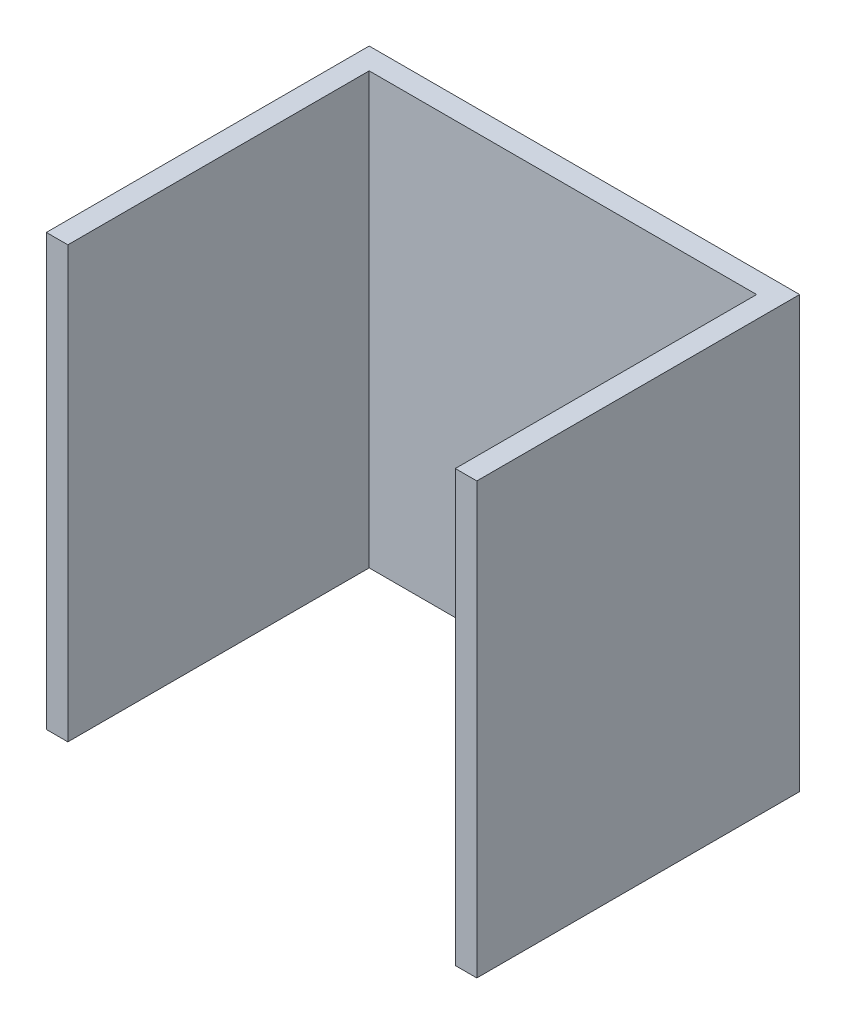
ISO-10303-21;
HEADER;
FILE_DESCRIPTION(('STEP AP214'),'2;1');
FILE_NAME('part.step','',(''),(''),'','','');
FILE_SCHEMA(('AUTOMOTIVE_DESIGN { 1 0 10303 214 1 1 1 1 }'));
ENDSEC;
DATA;
#1=APPLICATION_CONTEXT('core data for automotive mechanical design processes');
#2=APPLICATION_PROTOCOL_DEFINITION('international standard','automotive_design',2000,#1);
#3=PRODUCT_CONTEXT('',#1,'mechanical');
#4=PRODUCT('Part','Part','',(#3));
#5=PRODUCT_RELATED_PRODUCT_CATEGORY('part','',(#4));
#6=PRODUCT_DEFINITION_FORMATION('','',#4);
#7=PRODUCT_DEFINITION_CONTEXT('part definition',#1,'design');
#8=PRODUCT_DEFINITION('design','',#6,#7);
#9=PRODUCT_DEFINITION_SHAPE('','',#8);
#10=(LENGTH_UNIT() NAMED_UNIT(*) SI_UNIT(.MILLI.,.METRE.));
#11=(NAMED_UNIT(*) PLANE_ANGLE_UNIT() SI_UNIT($,.RADIAN.));
#12=(NAMED_UNIT(*) SI_UNIT($,.STERADIAN.) SOLID_ANGLE_UNIT());
#13=UNCERTAINTY_MEASURE_WITH_UNIT(LENGTH_MEASURE(1.E-05),#10,'distance_accuracy_value','');
#14=(GEOMETRIC_REPRESENTATION_CONTEXT(3) GLOBAL_UNCERTAINTY_ASSIGNED_CONTEXT((#13)) GLOBAL_UNIT_ASSIGNED_CONTEXT((#10,
#11,#12)) REPRESENTATION_CONTEXT('',''));
#15=CARTESIAN_POINT('',(0.,0.,0.));
#16=DIRECTION('',(0.,0.,1.));
#17=DIRECTION('',(1.,0.,0.));
#18=AXIS2_PLACEMENT_3D('',#15,#16,#17);
#19=CARTESIAN_POINT('',(0.,0.,0.));
#20=DIRECTION('',(0.,0.,1.));
#21=DIRECTION('',(1.,0.,0.));
#22=AXIS2_PLACEMENT_3D('',#19,#20,#21);
#23=PLANE('',#22);
#24=DIRECTION('',(1.,0.,0.));
#25=VECTOR('',#24,1.);
#26=CARTESIAN_POINT('',(-50.,-50.,0.));
#27=LINE('',#26,#25);
#28=CARTESIAN_POINT('',(-45.,-50.,0.));
#29=VERTEX_POINT('',#28);
#30=CARTESIAN_POINT('',(45.,-50.,0.));
#31=VERTEX_POINT('',#30);
#32=EDGE_CURVE('E55',#29,#31,#27,.T.);
#33=ORIENTED_EDGE('',*,*,#32,.T.);
#34=DIRECTION('',(0.,-1.,0.));
#35=VECTOR('',#34,1.);
#36=CARTESIAN_POINT('',(45.,50.,0.));
#37=LINE('',#36,#35);
#38=CARTESIAN_POINT('',(45.,50.,0.));
#39=VERTEX_POINT('',#38);
#40=EDGE_CURVE('E50',#39,#31,#37,.T.);
#41=ORIENTED_EDGE('',*,*,#40,.F.);
#42=DIRECTION('',(1.,0.,0.));
#43=VECTOR('',#42,1.);
#44=CARTESIAN_POINT('',(-50.,50.,0.));
#45=LINE('',#44,#43);
#46=CARTESIAN_POINT('',(-45.,50.,0.));
#47=VERTEX_POINT('',#46);
#48=EDGE_CURVE('E151',#47,#39,#45,.T.);
#49=ORIENTED_EDGE('',*,*,#48,.F.);
#50=DIRECTION('',(0.,1.,0.));
#51=VECTOR('',#50,1.);
#52=CARTESIAN_POINT('',(-45.,50.,0.));
#53=LINE('',#52,#51);
#54=EDGE_CURVE('E129',#29,#47,#53,.T.);
#55=ORIENTED_EDGE('',*,*,#54,.F.);
#56=EDGE_LOOP('',(#33,#41,#49,#55));
#57=FACE_BOUND('',#56,.T.);
#58=ADVANCED_FACE('F33',(#57),#23,.T.);
#59=CARTESIAN_POINT('',(-50.,-50.,-5.));
#60=DIRECTION('',(0.,-1.,0.));
#61=DIRECTION('',(0.,0.,-1.));
#62=AXIS2_PLACEMENT_3D('',#59,#60,#61);
#63=PLANE('',#62);
#64=ORIENTED_EDGE('',*,*,#32,.F.);
#65=DIRECTION('',(0.,0.,-1.));
#66=VECTOR('',#65,1.);
#67=CARTESIAN_POINT('',(-45.,-50.,70.));
#68=LINE('',#67,#66);
#69=CARTESIAN_POINT('',(-45.,-50.,70.));
#70=VERTEX_POINT('',#69);
#71=EDGE_CURVE('E145',#70,#29,#68,.T.);
#72=ORIENTED_EDGE('',*,*,#71,.F.);
#73=DIRECTION('',(1.,0.,0.));
#74=VECTOR('',#73,1.);
#75=CARTESIAN_POINT('',(-50.,-50.,70.));
#76=LINE('',#75,#74);
#77=CARTESIAN_POINT('',(-50.,-50.,70.));
#78=VERTEX_POINT('',#77);
#79=EDGE_CURVE('E133',#78,#70,#76,.T.);
#80=ORIENTED_EDGE('',*,*,#79,.F.);
#81=DIRECTION('',(0.,0.,1.));
#82=VECTOR('',#81,1.);
#83=CARTESIAN_POINT('',(-50.,-50.,-5.));
#84=LINE('',#83,#82);
#85=CARTESIAN_POINT('',(-50.,-50.,-5.));
#86=VERTEX_POINT('',#85);
#87=EDGE_CURVE('E11',#86,#78,#84,.T.);
#88=ORIENTED_EDGE('',*,*,#87,.F.);
#89=DIRECTION('',(1.,0.,0.));
#90=VECTOR('',#89,1.);
#91=CARTESIAN_POINT('',(-50.,-50.,-5.));
#92=LINE('',#91,#90);
#93=CARTESIAN_POINT('',(50.,-50.,-5.));
#94=VERTEX_POINT('',#93);
#95=EDGE_CURVE('E148',#86,#94,#92,.T.);
#96=ORIENTED_EDGE('',*,*,#95,.T.);
#97=DIRECTION('',(0.,0.,1.));
#98=VECTOR('',#97,1.);
#99=CARTESIAN_POINT('',(50.,-50.,-5.));
#100=LINE('',#99,#98);
#101=CARTESIAN_POINT('',(50.,-50.,70.));
#102=VERTEX_POINT('',#101);
#103=EDGE_CURVE('E37',#94,#102,#100,.T.);
#104=ORIENTED_EDGE('',*,*,#103,.T.);
#105=DIRECTION('',(1.,0.,0.));
#106=VECTOR('',#105,1.);
#107=CARTESIAN_POINT('',(50.,-50.,70.));
#108=LINE('',#107,#106);
#109=CARTESIAN_POINT('',(45.,-50.,70.));
#110=VERTEX_POINT('',#109);
#111=EDGE_CURVE('E119',#110,#102,#108,.T.);
#112=ORIENTED_EDGE('',*,*,#111,.F.);
#113=DIRECTION('',(0.,0.,-1.));
#114=VECTOR('',#113,1.);
#115=CARTESIAN_POINT('',(45.,-50.,70.));
#116=LINE('',#115,#114);
#117=EDGE_CURVE('E124',#110,#31,#116,.T.);
#118=ORIENTED_EDGE('',*,*,#117,.T.);
#119=EDGE_LOOP('',(#64,#72,#80,#88,#96,#104,#112,#118));
#120=FACE_BOUND('',#119,.T.);
#121=ADVANCED_FACE('F35',(#120),#63,.T.);
#122=CARTESIAN_POINT('',(-50.,-50.,-5.));
#123=DIRECTION('',(1.,0.,0.));
#124=DIRECTION('',(0.,1.,0.));
#125=AXIS2_PLACEMENT_3D('',#122,#123,#124);
#126=PLANE('',#125);
#127=ORIENTED_EDGE('',*,*,#87,.T.);
#128=DIRECTION('',(0.,-1.,0.));
#129=VECTOR('',#128,1.);
#130=CARTESIAN_POINT('',(-50.,50.,70.));
#131=LINE('',#130,#129);
#132=CARTESIAN_POINT('',(-50.,50.,70.));
#133=VERTEX_POINT('',#132);
#134=EDGE_CURVE('E130',#133,#78,#131,.T.);
#135=ORIENTED_EDGE('',*,*,#134,.F.);
#136=DIRECTION('',(0.,0.,1.));
#137=VECTOR('',#136,1.);
#138=CARTESIAN_POINT('',(-50.,50.,-5.));
#139=LINE('',#138,#137);
#140=CARTESIAN_POINT('',(-50.,50.,-5.));
#141=VERTEX_POINT('',#140);
#142=EDGE_CURVE('E42',#141,#133,#139,.T.);
#143=ORIENTED_EDGE('',*,*,#142,.F.);
#144=DIRECTION('',(0.,1.,0.));
#145=VECTOR('',#144,1.);
#146=CARTESIAN_POINT('',(-50.,-50.,-5.));
#147=LINE('',#146,#145);
#148=EDGE_CURVE('E155',#86,#141,#147,.T.);
#149=ORIENTED_EDGE('',*,*,#148,.F.);
#150=EDGE_LOOP('',(#127,#135,#143,#149));
#151=FACE_BOUND('',#150,.T.);
#152=ADVANCED_FACE('F168',(#151),#126,.F.);
#153=CARTESIAN_POINT('',(-50.,50.,-5.));
#154=DIRECTION('',(0.,-1.,0.));
#155=DIRECTION('',(1.,0.,0.));
#156=AXIS2_PLACEMENT_3D('',#153,#154,#155);
#157=PLANE('',#156);
#158=ORIENTED_EDGE('',*,*,#142,.T.);
#159=DIRECTION('',(-1.,0.,0.));
#160=VECTOR('',#159,1.);
#161=CARTESIAN_POINT('',(-50.,50.,70.));
#162=LINE('',#161,#160);
#163=CARTESIAN_POINT('',(-45.,50.,70.));
#164=VERTEX_POINT('',#163);
#165=EDGE_CURVE('E137',#164,#133,#162,.T.);
#166=ORIENTED_EDGE('',*,*,#165,.F.);
#167=DIRECTION('',(0.,0.,-1.));
#168=VECTOR('',#167,1.);
#169=CARTESIAN_POINT('',(-45.,50.,70.));
#170=LINE('',#169,#168);
#171=EDGE_CURVE('E140',#164,#47,#170,.T.);
#172=ORIENTED_EDGE('',*,*,#171,.T.);
#173=ORIENTED_EDGE('',*,*,#48,.T.);
#174=DIRECTION('',(0.,0.,-1.));
#175=VECTOR('',#174,1.);
#176=CARTESIAN_POINT('',(45.,50.,70.));
#177=LINE('',#176,#175);
#178=CARTESIAN_POINT('',(45.,50.,70.));
#179=VERTEX_POINT('',#178);
#180=EDGE_CURVE('E111',#179,#39,#177,.T.);
#181=ORIENTED_EDGE('',*,*,#180,.F.);
#182=DIRECTION('',(-1.,0.,0.));
#183=VECTOR('',#182,1.);
#184=CARTESIAN_POINT('',(50.,50.,70.));
#185=LINE('',#184,#183);
#186=CARTESIAN_POINT('',(50.,50.,70.));
#187=VERTEX_POINT('',#186);
#188=EDGE_CURVE('E108',#187,#179,#185,.T.);
#189=ORIENTED_EDGE('',*,*,#188,.F.);
#190=DIRECTION('',(0.,0.,1.));
#191=VECTOR('',#190,1.);
#192=CARTESIAN_POINT('',(50.,50.,-5.));
#193=LINE('',#192,#191);
#194=CARTESIAN_POINT('',(50.,50.,-5.));
#195=VERTEX_POINT('',#194);
#196=EDGE_CURVE('E98',#195,#187,#193,.T.);
#197=ORIENTED_EDGE('',*,*,#196,.F.);
#198=DIRECTION('',(1.,0.,0.));
#199=VECTOR('',#198,1.);
#200=CARTESIAN_POINT('',(-50.,50.,-5.));
#201=LINE('',#200,#199);
#202=EDGE_CURVE('E153',#141,#195,#201,.T.);
#203=ORIENTED_EDGE('',*,*,#202,.F.);
#204=EDGE_LOOP('',(#158,#166,#172,#173,#181,#189,#197,#203));
#205=FACE_BOUND('',#204,.T.);
#206=ADVANCED_FACE('F109',(#205),#157,.F.);
#207=CARTESIAN_POINT('',(50.,-50.,-5.));
#208=DIRECTION('',(1.,0.,0.));
#209=DIRECTION('',(0.,1.,0.));
#210=AXIS2_PLACEMENT_3D('',#207,#208,#209);
#211=PLANE('',#210);
#212=ORIENTED_EDGE('',*,*,#196,.T.);
#213=DIRECTION('',(0.,1.,0.));
#214=VECTOR('',#213,1.);
#215=CARTESIAN_POINT('',(50.,50.,70.));
#216=LINE('',#215,#214);
#217=EDGE_CURVE('E102',#102,#187,#216,.T.);
#218=ORIENTED_EDGE('',*,*,#217,.F.);
#219=ORIENTED_EDGE('',*,*,#103,.F.);
#220=DIRECTION('',(0.,1.,0.));
#221=VECTOR('',#220,1.);
#222=CARTESIAN_POINT('',(50.,-50.,-5.));
#223=LINE('',#222,#221);
#224=EDGE_CURVE('E104',#94,#195,#223,.T.);
#225=ORIENTED_EDGE('',*,*,#224,.T.);
#226=EDGE_LOOP('',(#212,#218,#219,#225));
#227=FACE_BOUND('',#226,.T.);
#228=ADVANCED_FACE('F100',(#227),#211,.T.);
#229=CARTESIAN_POINT('',(0.,0.,-5.));
#230=DIRECTION('',(0.,0.,1.));
#231=DIRECTION('',(1.,0.,0.));
#232=AXIS2_PLACEMENT_3D('',#229,#230,#231);
#233=PLANE('',#232);
#234=ORIENTED_EDGE('',*,*,#95,.F.);
#235=ORIENTED_EDGE('',*,*,#148,.T.);
#236=ORIENTED_EDGE('',*,*,#202,.T.);
#237=ORIENTED_EDGE('',*,*,#224,.F.);
#238=EDGE_LOOP('',(#234,#235,#236,#237));
#239=FACE_BOUND('',#238,.T.);
#240=ADVANCED_FACE('F179',(#239),#233,.F.);
#241=CARTESIAN_POINT('',(-45.,50.,70.));
#242=DIRECTION('',(-1.,0.,0.));
#243=DIRECTION('',(0.,-1.,0.));
#244=AXIS2_PLACEMENT_3D('',#241,#242,#243);
#245=PLANE('',#244);
#246=ORIENTED_EDGE('',*,*,#54,.T.);
#247=ORIENTED_EDGE('',*,*,#171,.F.);
#248=DIRECTION('',(0.,1.,0.));
#249=VECTOR('',#248,1.);
#250=CARTESIAN_POINT('',(-45.,50.,70.));
#251=LINE('',#250,#249);
#252=EDGE_CURVE('E135',#70,#164,#251,.T.);
#253=ORIENTED_EDGE('',*,*,#252,.F.);
#254=ORIENTED_EDGE('',*,*,#71,.T.);
#255=EDGE_LOOP('',(#246,#247,#253,#254));
#256=FACE_BOUND('',#255,.T.);
#257=ADVANCED_FACE('F174',(#256),#245,.F.);
#258=CARTESIAN_POINT('',(0.,0.,70.));
#259=DIRECTION('',(0.,0.,1.));
#260=DIRECTION('',(1.,0.,0.));
#261=AXIS2_PLACEMENT_3D('',#258,#259,#260);
#262=PLANE('',#261);
#263=ORIENTED_EDGE('',*,*,#134,.T.);
#264=ORIENTED_EDGE('',*,*,#79,.T.);
#265=ORIENTED_EDGE('',*,*,#252,.T.);
#266=ORIENTED_EDGE('',*,*,#165,.T.);
#267=EDGE_LOOP('',(#263,#264,#265,#266));
#268=FACE_BOUND('',#267,.T.);
#269=ADVANCED_FACE('F165',(#268),#262,.T.);
#270=CARTESIAN_POINT('',(45.,50.,70.));
#271=DIRECTION('',(1.,0.,0.));
#272=DIRECTION('',(0.,1.,0.));
#273=AXIS2_PLACEMENT_3D('',#270,#271,#272);
#274=PLANE('',#273);
#275=ORIENTED_EDGE('',*,*,#40,.T.);
#276=ORIENTED_EDGE('',*,*,#117,.F.);
#277=DIRECTION('',(0.,-1.,0.));
#278=VECTOR('',#277,1.);
#279=CARTESIAN_POINT('',(45.,50.,70.));
#280=LINE('',#279,#278);
#281=EDGE_CURVE('E114',#179,#110,#280,.T.);
#282=ORIENTED_EDGE('',*,*,#281,.F.);
#283=ORIENTED_EDGE('',*,*,#180,.T.);
#284=EDGE_LOOP('',(#275,#276,#282,#283));
#285=FACE_BOUND('',#284,.T.);
#286=ADVANCED_FACE('F176',(#285),#274,.F.);
#287=CARTESIAN_POINT('',(0.,0.,70.));
#288=DIRECTION('',(0.,0.,-1.));
#289=DIRECTION('',(-1.,0.,0.));
#290=AXIS2_PLACEMENT_3D('',#287,#288,#289);
#291=PLANE('',#290);
#292=ORIENTED_EDGE('',*,*,#217,.T.);
#293=ORIENTED_EDGE('',*,*,#188,.T.);
#294=ORIENTED_EDGE('',*,*,#281,.T.);
#295=ORIENTED_EDGE('',*,*,#111,.T.);
#296=EDGE_LOOP('',(#292,#293,#294,#295));
#297=FACE_BOUND('',#296,.T.);
#298=ADVANCED_FACE('F117',(#297),#291,.F.);
#299=CLOSED_SHELL('',(#58,#121,#152,#206,#228,#240,#257,#269,#286,#298));
#300=MANIFOLD_SOLID_BREP('B2',#299);
#301=ADVANCED_BREP_SHAPE_REPRESENTATION('',(#18,#300),#14);
#302=SHAPE_DEFINITION_REPRESENTATION(#9,#301);
ENDSEC;
END-ISO-10303-21;
